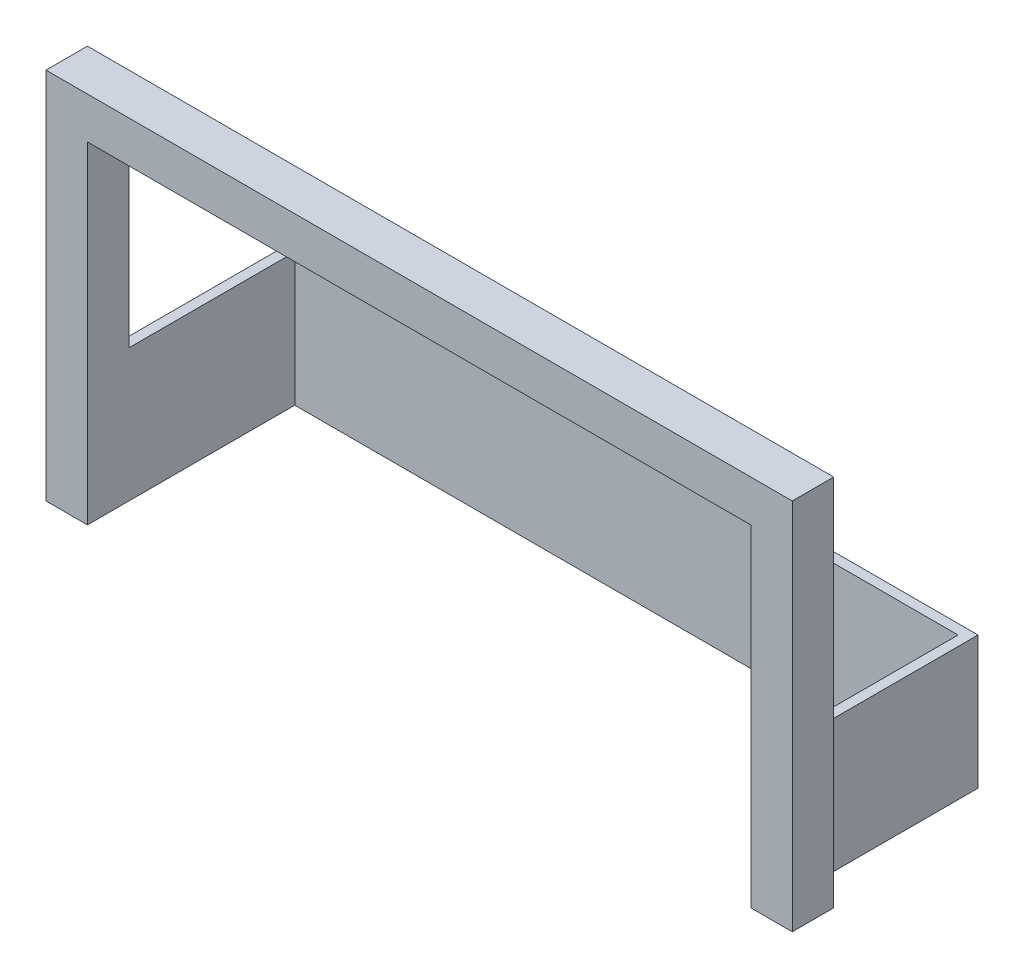
ISO-10303-21;
HEADER;
FILE_DESCRIPTION(('STEP AP214'),'2;1');
FILE_NAME('part.step','',(''),(''),'','','');
FILE_SCHEMA(('AUTOMOTIVE_DESIGN { 1 0 10303 214 1 1 1 1 }'));
ENDSEC;
DATA;
#1=APPLICATION_CONTEXT('core data for automotive mechanical design processes');
#2=APPLICATION_PROTOCOL_DEFINITION('international standard','automotive_design',2000,#1);
#3=PRODUCT_CONTEXT('',#1,'mechanical');
#4=PRODUCT('Part','Part','',(#3));
#5=PRODUCT_RELATED_PRODUCT_CATEGORY('part','',(#4));
#6=PRODUCT_DEFINITION_FORMATION('','',#4);
#7=PRODUCT_DEFINITION_CONTEXT('part definition',#1,'design');
#8=PRODUCT_DEFINITION('design','',#6,#7);
#9=PRODUCT_DEFINITION_SHAPE('','',#8);
#10=(LENGTH_UNIT() NAMED_UNIT(*) SI_UNIT(.MILLI.,.METRE.));
#11=(NAMED_UNIT(*) PLANE_ANGLE_UNIT() SI_UNIT($,.RADIAN.));
#12=(NAMED_UNIT(*) SI_UNIT($,.STERADIAN.) SOLID_ANGLE_UNIT());
#13=UNCERTAINTY_MEASURE_WITH_UNIT(LENGTH_MEASURE(1.E-05),#10,'distance_accuracy_value','');
#14=(GEOMETRIC_REPRESENTATION_CONTEXT(3) GLOBAL_UNCERTAINTY_ASSIGNED_CONTEXT((#13)) GLOBAL_UNIT_ASSIGNED_CONTEXT((#10,
#11,#12)) REPRESENTATION_CONTEXT('',''));
#15=CARTESIAN_POINT('',(0.,0.,0.));
#16=DIRECTION('',(0.,0.,1.));
#17=DIRECTION('',(1.,0.,0.));
#18=AXIS2_PLACEMENT_3D('',#15,#16,#17);
#19=CARTESIAN_POINT('',(1000.,1000.,-125.));
#20=DIRECTION('',(-1.,0.,0.));
#21=DIRECTION('',(0.,0.,1.));
#22=AXIS2_PLACEMENT_3D('',#19,#20,#21);
#23=PLANE('',#22);
#24=DIRECTION('',(0.,-1.,0.));
#25=VECTOR('',#24,1.);
#26=CARTESIAN_POINT('',(1000.,1000.,0.));
#27=LINE('',#26,#25);
#28=CARTESIAN_POINT('',(1000.,1000.,0.));
#29=VERTEX_POINT('',#28);
#30=CARTESIAN_POINT('',(1000.,0.,0.));
#31=VERTEX_POINT('',#30);
#32=EDGE_CURVE('E166',#29,#31,#27,.T.);
#33=ORIENTED_EDGE('',*,*,#32,.F.);
#34=DIRECTION('',(0.,0.,1.));
#35=VECTOR('',#34,1.);
#36=CARTESIAN_POINT('',(1000.,1000.,-125.));
#37=LINE('',#36,#35);
#38=CARTESIAN_POINT('',(1000.,1000.,-125.));
#39=VERTEX_POINT('',#38);
#40=EDGE_CURVE('E44',#39,#29,#37,.T.);
#41=ORIENTED_EDGE('',*,*,#40,.F.);
#42=DIRECTION('',(0.,-1.,0.));
#43=VECTOR('',#42,1.);
#44=CARTESIAN_POINT('',(1000.,1000.,-125.));
#45=LINE('',#44,#43);
#46=CARTESIAN_POINT('',(1000.,400.,-125.));
#47=VERTEX_POINT('',#46);
#48=EDGE_CURVE('E145',#39,#47,#45,.T.);
#49=ORIENTED_EDGE('',*,*,#48,.T.);
#50=DIRECTION('',(0.,0.,1.));
#51=VECTOR('',#50,1.);
#52=CARTESIAN_POINT('',(1000.,400.,-625.));
#53=LINE('',#52,#51);
#54=CARTESIAN_POINT('',(1000.,400.,-625.));
#55=VERTEX_POINT('',#54);
#56=EDGE_CURVE('E224',#55,#47,#53,.T.);
#57=ORIENTED_EDGE('',*,*,#56,.F.);
#58=DIRECTION('',(0.,-1.,0.));
#59=VECTOR('',#58,1.);
#60=CARTESIAN_POINT('',(1000.,400.,-625.));
#61=LINE('',#60,#59);
#62=CARTESIAN_POINT('',(1000.,3.06161699786838E-13,-625.));
#63=VERTEX_POINT('',#62);
#64=EDGE_CURVE('E281',#55,#63,#61,.T.);
#65=ORIENTED_EDGE('',*,*,#64,.T.);
#66=DIRECTION('',(0.,0.,1.));
#67=VECTOR('',#66,1.);
#68=CARTESIAN_POINT('',(1000.,0.,-125.));
#69=LINE('',#68,#67);
#70=EDGE_CURVE('E11',#63,#31,#69,.T.);
#71=ORIENTED_EDGE('',*,*,#70,.T.);
#72=EDGE_LOOP('',(#33,#41,#49,#57,#65,#71));
#73=FACE_BOUND('',#72,.T.);
#74=ADVANCED_FACE('F35',(#73),#23,.T.);
#75=CARTESIAN_POINT('',(-1000.,1000.,-125.));
#76=DIRECTION('',(0.,-1.,0.));
#77=DIRECTION('',(0.,0.,-1.));
#78=AXIS2_PLACEMENT_3D('',#75,#76,#77);
#79=PLANE('',#78);
#80=DIRECTION('',(1.,0.,0.));
#81=VECTOR('',#80,1.);
#82=CARTESIAN_POINT('',(-1000.,1000.,0.));
#83=LINE('',#82,#81);
#84=CARTESIAN_POINT('',(-1000.,1000.,0.));
#85=VERTEX_POINT('',#84);
#86=EDGE_CURVE('E163',#85,#29,#83,.T.);
#87=ORIENTED_EDGE('',*,*,#86,.F.);
#88=DIRECTION('',(0.,0.,1.));
#89=VECTOR('',#88,1.);
#90=CARTESIAN_POINT('',(-1000.,1000.,-125.));
#91=LINE('',#90,#89);
#92=CARTESIAN_POINT('',(-1000.,1000.,-125.));
#93=VERTEX_POINT('',#92);
#94=EDGE_CURVE('E170',#93,#85,#91,.T.);
#95=ORIENTED_EDGE('',*,*,#94,.F.);
#96=DIRECTION('',(1.,0.,0.));
#97=VECTOR('',#96,1.);
#98=CARTESIAN_POINT('',(-1000.,1000.,-125.));
#99=LINE('',#98,#97);
#100=EDGE_CURVE('E143',#93,#39,#99,.T.);
#101=ORIENTED_EDGE('',*,*,#100,.T.);
#102=ORIENTED_EDGE('',*,*,#40,.T.);
#103=EDGE_LOOP('',(#87,#95,#101,#102));
#104=FACE_BOUND('',#103,.T.);
#105=ADVANCED_FACE('F183',(#104),#79,.T.);
#106=CARTESIAN_POINT('',(-1000.,1000.,-125.));
#107=DIRECTION('',(1.,0.,0.));
#108=DIRECTION('',(0.,1.,0.));
#109=AXIS2_PLACEMENT_3D('',#106,#107,#108);
#110=PLANE('',#109);
#111=DIRECTION('',(0.,1.,0.));
#112=VECTOR('',#111,1.);
#113=CARTESIAN_POINT('',(-1000.,1000.,0.));
#114=LINE('',#113,#112);
#115=CARTESIAN_POINT('',(-1000.,0.,0.));
#116=VERTEX_POINT('',#115);
#117=EDGE_CURVE('E160',#116,#85,#114,.T.);
#118=ORIENTED_EDGE('',*,*,#117,.F.);
#119=DIRECTION('',(0.,0.,1.));
#120=VECTOR('',#119,1.);
#121=CARTESIAN_POINT('',(-1000.,0.,-125.));
#122=LINE('',#121,#120);
#123=CARTESIAN_POINT('',(-1000.,-3.06161699786838E-13,-625.));
#124=VERTEX_POINT('',#123);
#125=EDGE_CURVE('E120',#124,#116,#122,.T.);
#126=ORIENTED_EDGE('',*,*,#125,.F.);
#127=DIRECTION('',(0.,-1.,0.));
#128=VECTOR('',#127,1.);
#129=CARTESIAN_POINT('',(-1000.,400.,-625.));
#130=LINE('',#129,#128);
#131=CARTESIAN_POINT('',(-1000.,400.,-625.));
#132=VERTEX_POINT('',#131);
#133=EDGE_CURVE('E279',#132,#124,#130,.T.);
#134=ORIENTED_EDGE('',*,*,#133,.F.);
#135=DIRECTION('',(0.,0.,-1.));
#136=VECTOR('',#135,1.);
#137=CARTESIAN_POINT('',(-1000.,400.,-125.));
#138=LINE('',#137,#136);
#139=CARTESIAN_POINT('',(-1000.,400.,-125.));
#140=VERTEX_POINT('',#139);
#141=EDGE_CURVE('E296',#140,#132,#138,.T.);
#142=ORIENTED_EDGE('',*,*,#141,.F.);
#143=DIRECTION('',(0.,1.,0.));
#144=VECTOR('',#143,1.);
#145=CARTESIAN_POINT('',(-1000.,1000.,-125.));
#146=LINE('',#145,#144);
#147=EDGE_CURVE('E133',#140,#93,#146,.T.);
#148=ORIENTED_EDGE('',*,*,#147,.T.);
#149=ORIENTED_EDGE('',*,*,#94,.T.);
#150=EDGE_LOOP('',(#118,#126,#134,#142,#148,#149));
#151=FACE_BOUND('',#150,.T.);
#152=ADVANCED_FACE('F188',(#151),#110,.T.);
#153=CARTESIAN_POINT('',(-1125.,0.,-125.));
#154=DIRECTION('',(0.,-1.,0.));
#155=DIRECTION('',(1.,0.,0.));
#156=AXIS2_PLACEMENT_3D('',#153,#154,#155);
#157=PLANE('',#156);
#158=DIRECTION('',(1.,0.,0.));
#159=VECTOR('',#158,1.);
#160=CARTESIAN_POINT('',(-1125.,0.,0.));
#161=LINE('',#160,#159);
#162=CARTESIAN_POINT('',(-1125.,0.,0.));
#163=VERTEX_POINT('',#162);
#164=EDGE_CURVE('E115',#163,#116,#161,.T.);
#165=ORIENTED_EDGE('',*,*,#164,.F.);
#166=DIRECTION('',(0.,0.,1.));
#167=VECTOR('',#166,1.);
#168=CARTESIAN_POINT('',(-1125.,0.,-125.));
#169=LINE('',#168,#167);
#170=CARTESIAN_POINT('',(-1125.,0.,-125.));
#171=VERTEX_POINT('',#170);
#172=EDGE_CURVE('E108',#171,#163,#169,.T.);
#173=ORIENTED_EDGE('',*,*,#172,.F.);
#174=DIRECTION('',(1.,0.,0.));
#175=VECTOR('',#174,1.);
#176=CARTESIAN_POINT('',(-1125.,0.,-125.));
#177=LINE('',#176,#175);
#178=CARTESIAN_POINT('',(-1030.,-3.15346550780443E-13,-125.));
#179=VERTEX_POINT('',#178);
#180=EDGE_CURVE('E113',#171,#179,#177,.T.);
#181=ORIENTED_EDGE('',*,*,#180,.T.);
#182=DIRECTION('',(0.,0.,-1.));
#183=VECTOR('',#182,1.);
#184=CARTESIAN_POINT('',(-1030.,-3.15346550780443E-13,-125.));
#185=LINE('',#184,#183);
#186=CARTESIAN_POINT('',(-1030.,-3.15346550780443E-13,-655.));
#187=VERTEX_POINT('',#186);
#188=EDGE_CURVE('E270',#179,#187,#185,.T.);
#189=ORIENTED_EDGE('',*,*,#188,.T.);
#190=DIRECTION('',(1.,0.,0.));
#191=VECTOR('',#190,1.);
#192=CARTESIAN_POINT('',(-1000.,-3.06161699786838E-13,-655.));
#193=LINE('',#192,#191);
#194=CARTESIAN_POINT('',(1030.,3.15346550780443E-13,-655.));
#195=VERTEX_POINT('',#194);
#196=EDGE_CURVE('E259',#187,#195,#193,.T.);
#197=ORIENTED_EDGE('',*,*,#196,.T.);
#198=DIRECTION('',(0.,0.,1.));
#199=VECTOR('',#198,1.);
#200=CARTESIAN_POINT('',(1030.,3.15346550780443E-13,-625.));
#201=LINE('',#200,#199);
#202=CARTESIAN_POINT('',(1030.,0.,-125.));
#203=VERTEX_POINT('',#202);
#204=EDGE_CURVE('E52',#195,#203,#201,.T.);
#205=ORIENTED_EDGE('',*,*,#204,.T.);
#206=DIRECTION('',(1.,0.,0.));
#207=VECTOR('',#206,1.);
#208=CARTESIAN_POINT('',(1000.,0.,-125.));
#209=LINE('',#208,#207);
#210=CARTESIAN_POINT('',(1125.,0.,-125.));
#211=VERTEX_POINT('',#210);
#212=EDGE_CURVE('E95',#203,#211,#209,.T.);
#213=ORIENTED_EDGE('',*,*,#212,.T.);
#214=DIRECTION('',(0.,0.,1.));
#215=VECTOR('',#214,1.);
#216=CARTESIAN_POINT('',(1125.,0.,-125.));
#217=LINE('',#216,#215);
#218=CARTESIAN_POINT('',(1125.,0.,0.));
#219=VERTEX_POINT('',#218);
#220=EDGE_CURVE('E39',#211,#219,#217,.T.);
#221=ORIENTED_EDGE('',*,*,#220,.T.);
#222=DIRECTION('',(1.,0.,0.));
#223=VECTOR('',#222,1.);
#224=CARTESIAN_POINT('',(1000.,0.,0.));
#225=LINE('',#224,#223);
#226=EDGE_CURVE('E147',#31,#219,#225,.T.);
#227=ORIENTED_EDGE('',*,*,#226,.F.);
#228=ORIENTED_EDGE('',*,*,#70,.F.);
#229=DIRECTION('',(1.,0.,0.));
#230=VECTOR('',#229,1.);
#231=CARTESIAN_POINT('',(-1000.,-3.06161699786838E-13,-625.));
#232=LINE('',#231,#230);
#233=EDGE_CURVE('E268',#124,#63,#232,.T.);
#234=ORIENTED_EDGE('',*,*,#233,.F.);
#235=ORIENTED_EDGE('',*,*,#125,.T.);
#236=EDGE_LOOP('',(#165,#173,#181,#189,#197,#205,#213,#221,#227,#228,#234,#235));
#237=FACE_BOUND('',#236,.T.);
#238=ADVANCED_FACE('F110',(#237),#157,.T.);
#239=CARTESIAN_POINT('',(-1125.,1125.,-125.));
#240=DIRECTION('',(-1.,0.,0.));
#241=DIRECTION('',(0.,-1.,0.));
#242=AXIS2_PLACEMENT_3D('',#239,#240,#241);
#243=PLANE('',#242);
#244=DIRECTION('',(0.,-1.,0.));
#245=VECTOR('',#244,1.);
#246=CARTESIAN_POINT('',(-1125.,1125.,0.));
#247=LINE('',#246,#245);
#248=CARTESIAN_POINT('',(-1125.,1125.,0.));
#249=VERTEX_POINT('',#248);
#250=EDGE_CURVE('E157',#249,#163,#247,.T.);
#251=ORIENTED_EDGE('',*,*,#250,.F.);
#252=DIRECTION('',(0.,0.,1.));
#253=VECTOR('',#252,1.);
#254=CARTESIAN_POINT('',(-1125.,1125.,-125.));
#255=LINE('',#254,#253);
#256=CARTESIAN_POINT('',(-1125.,1125.,-125.));
#257=VERTEX_POINT('',#256);
#258=EDGE_CURVE('E121',#257,#249,#255,.T.);
#259=ORIENTED_EDGE('',*,*,#258,.F.);
#260=DIRECTION('',(0.,-1.,0.));
#261=VECTOR('',#260,1.);
#262=CARTESIAN_POINT('',(-1125.,1125.,-125.));
#263=LINE('',#262,#261);
#264=EDGE_CURVE('E128',#257,#171,#263,.T.);
#265=ORIENTED_EDGE('',*,*,#264,.T.);
#266=ORIENTED_EDGE('',*,*,#172,.T.);
#267=EDGE_LOOP('',(#251,#259,#265,#266));
#268=FACE_BOUND('',#267,.T.);
#269=ADVANCED_FACE('F135',(#268),#243,.T.);
#270=CARTESIAN_POINT('',(-1125.,1125.,-125.));
#271=DIRECTION('',(0.,1.,0.));
#272=DIRECTION('',(0.,0.,1.));
#273=AXIS2_PLACEMENT_3D('',#270,#271,#272);
#274=PLANE('',#273);
#275=DIRECTION('',(-1.,0.,0.));
#276=VECTOR('',#275,1.);
#277=CARTESIAN_POINT('',(-1125.,1125.,0.));
#278=LINE('',#277,#276);
#279=CARTESIAN_POINT('',(1125.,1125.,0.));
#280=VERTEX_POINT('',#279);
#281=EDGE_CURVE('E154',#280,#249,#278,.T.);
#282=ORIENTED_EDGE('',*,*,#281,.F.);
#283=DIRECTION('',(0.,0.,1.));
#284=VECTOR('',#283,1.);
#285=CARTESIAN_POINT('',(1125.,1125.,-125.));
#286=LINE('',#285,#284);
#287=CARTESIAN_POINT('',(1125.,1125.,-125.));
#288=VERTEX_POINT('',#287);
#289=EDGE_CURVE('E173',#288,#280,#286,.T.);
#290=ORIENTED_EDGE('',*,*,#289,.F.);
#291=DIRECTION('',(-1.,0.,0.));
#292=VECTOR('',#291,1.);
#293=CARTESIAN_POINT('',(-1125.,1125.,-125.));
#294=LINE('',#293,#292);
#295=EDGE_CURVE('E136',#288,#257,#294,.T.);
#296=ORIENTED_EDGE('',*,*,#295,.T.);
#297=ORIENTED_EDGE('',*,*,#258,.T.);
#298=EDGE_LOOP('',(#282,#290,#296,#297));
#299=FACE_BOUND('',#298,.T.);
#300=ADVANCED_FACE('F200',(#299),#274,.T.);
#301=CARTESIAN_POINT('',(1125.,1125.,-125.));
#302=DIRECTION('',(1.,0.,0.));
#303=DIRECTION('',(0.,1.,0.));
#304=AXIS2_PLACEMENT_3D('',#301,#302,#303);
#305=PLANE('',#304);
#306=DIRECTION('',(0.,1.,0.));
#307=VECTOR('',#306,1.);
#308=CARTESIAN_POINT('',(1125.,1125.,0.));
#309=LINE('',#308,#307);
#310=EDGE_CURVE('E150',#219,#280,#309,.T.);
#311=ORIENTED_EDGE('',*,*,#310,.F.);
#312=ORIENTED_EDGE('',*,*,#220,.F.);
#313=DIRECTION('',(0.,1.,0.));
#314=VECTOR('',#313,1.);
#315=CARTESIAN_POINT('',(1125.,1125.,-125.));
#316=LINE('',#315,#314);
#317=EDGE_CURVE('E138',#211,#288,#316,.T.);
#318=ORIENTED_EDGE('',*,*,#317,.T.);
#319=ORIENTED_EDGE('',*,*,#289,.T.);
#320=EDGE_LOOP('',(#311,#312,#318,#319));
#321=FACE_BOUND('',#320,.T.);
#322=ADVANCED_FACE('F37',(#321),#305,.T.);
#323=CARTESIAN_POINT('',(0.,0.,-125.));
#324=DIRECTION('',(0.,0.,-1.));
#325=DIRECTION('',(-1.,0.,0.));
#326=AXIS2_PLACEMENT_3D('',#323,#324,#325);
#327=PLANE('',#326);
#328=DIRECTION('',(0.,-1.,0.));
#329=VECTOR('',#328,1.);
#330=CARTESIAN_POINT('',(-1030.,400.,-125.));
#331=LINE('',#330,#329);
#332=CARTESIAN_POINT('',(-1030.,400.,-125.));
#333=VERTEX_POINT('',#332);
#334=EDGE_CURVE('E132',#333,#179,#331,.T.);
#335=ORIENTED_EDGE('',*,*,#334,.T.);
#336=ORIENTED_EDGE('',*,*,#180,.F.);
#337=ORIENTED_EDGE('',*,*,#264,.F.);
#338=ORIENTED_EDGE('',*,*,#295,.F.);
#339=ORIENTED_EDGE('',*,*,#317,.F.);
#340=ORIENTED_EDGE('',*,*,#212,.F.);
#341=DIRECTION('',(0.,-1.,0.));
#342=VECTOR('',#341,1.);
#343=CARTESIAN_POINT('',(1030.,400.,-125.));
#344=LINE('',#343,#342);
#345=CARTESIAN_POINT('',(1030.,400.,-125.));
#346=VERTEX_POINT('',#345);
#347=EDGE_CURVE('E267',#346,#203,#344,.T.);
#348=ORIENTED_EDGE('',*,*,#347,.F.);
#349=DIRECTION('',(1.,0.,0.));
#350=VECTOR('',#349,1.);
#351=CARTESIAN_POINT('',(1000.,400.,-125.));
#352=LINE('',#351,#350);
#353=EDGE_CURVE('E220',#47,#346,#352,.T.);
#354=ORIENTED_EDGE('',*,*,#353,.F.);
#355=ORIENTED_EDGE('',*,*,#48,.F.);
#356=ORIENTED_EDGE('',*,*,#100,.F.);
#357=ORIENTED_EDGE('',*,*,#147,.F.);
#358=DIRECTION('',(1.,0.,0.));
#359=VECTOR('',#358,1.);
#360=CARTESIAN_POINT('',(-1030.,400.,-125.));
#361=LINE('',#360,#359);
#362=EDGE_CURVE('E286',#333,#140,#361,.T.);
#363=ORIENTED_EDGE('',*,*,#362,.F.);
#364=EDGE_LOOP('',(#335,#336,#337,#338,#339,#340,#348,#354,#355,#356,#357,#363));
#365=FACE_BOUND('',#364,.T.);
#366=ADVANCED_FACE('F126',(#365),#327,.T.);
#367=CARTESIAN_POINT('',(0.,0.,0.));
#368=DIRECTION('',(0.,0.,-1.));
#369=DIRECTION('',(-1.,0.,0.));
#370=AXIS2_PLACEMENT_3D('',#367,#368,#369);
#371=PLANE('',#370);
#372=ORIENTED_EDGE('',*,*,#226,.T.);
#373=ORIENTED_EDGE('',*,*,#310,.T.);
#374=ORIENTED_EDGE('',*,*,#281,.T.);
#375=ORIENTED_EDGE('',*,*,#250,.T.);
#376=ORIENTED_EDGE('',*,*,#164,.T.);
#377=ORIENTED_EDGE('',*,*,#117,.T.);
#378=ORIENTED_EDGE('',*,*,#86,.T.);
#379=ORIENTED_EDGE('',*,*,#32,.T.);
#380=EDGE_LOOP('',(#372,#373,#374,#375,#376,#377,#378,#379));
#381=FACE_BOUND('',#380,.T.);
#382=ADVANCED_FACE('F180',(#381),#371,.F.);
#383=CARTESIAN_POINT('',(1030.,400.,-625.));
#384=DIRECTION('',(1.,0.,0.));
#385=DIRECTION('',(0.,1.,0.));
#386=AXIS2_PLACEMENT_3D('',#383,#384,#385);
#387=PLANE('',#386);
#388=ORIENTED_EDGE('',*,*,#204,.F.);
#389=DIRECTION('',(0.,-1.,0.));
#390=VECTOR('',#389,1.);
#391=CARTESIAN_POINT('',(1030.,400.,-655.));
#392=LINE('',#391,#390);
#393=CARTESIAN_POINT('',(1030.,400.,-655.));
#394=VERTEX_POINT('',#393);
#395=EDGE_CURVE('E151',#394,#195,#392,.T.);
#396=ORIENTED_EDGE('',*,*,#395,.F.);
#397=DIRECTION('',(0.,0.,1.));
#398=VECTOR('',#397,1.);
#399=CARTESIAN_POINT('',(1030.,400.,-625.));
#400=LINE('',#399,#398);
#401=EDGE_CURVE('E271',#394,#346,#400,.T.);
#402=ORIENTED_EDGE('',*,*,#401,.T.);
#403=ORIENTED_EDGE('',*,*,#347,.T.);
#404=EDGE_LOOP('',(#388,#396,#402,#403));
#405=FACE_BOUND('',#404,.T.);
#406=ADVANCED_FACE('F266',(#405),#387,.T.);
#407=CARTESIAN_POINT('',(-1000.,400.,-655.));
#408=DIRECTION('',(0.,0.,-1.));
#409=DIRECTION('',(-1.,0.,0.));
#410=AXIS2_PLACEMENT_3D('',#407,#408,#409);
#411=PLANE('',#410);
#412=ORIENTED_EDGE('',*,*,#196,.F.);
#413=DIRECTION('',(0.,-1.,0.));
#414=VECTOR('',#413,1.);
#415=CARTESIAN_POINT('',(-1030.,400.,-655.));
#416=LINE('',#415,#414);
#417=CARTESIAN_POINT('',(-1030.,400.,-655.));
#418=VERTEX_POINT('',#417);
#419=EDGE_CURVE('E253',#418,#187,#416,.T.);
#420=ORIENTED_EDGE('',*,*,#419,.F.);
#421=DIRECTION('',(1.,0.,0.));
#422=VECTOR('',#421,1.);
#423=CARTESIAN_POINT('',(-1000.,400.,-655.));
#424=LINE('',#423,#422);
#425=EDGE_CURVE('E261',#418,#394,#424,.T.);
#426=ORIENTED_EDGE('',*,*,#425,.T.);
#427=ORIENTED_EDGE('',*,*,#395,.T.);
#428=EDGE_LOOP('',(#412,#420,#426,#427));
#429=FACE_BOUND('',#428,.T.);
#430=ADVANCED_FACE('F258',(#429),#411,.T.);
#431=CARTESIAN_POINT('',(-1030.,400.,-125.));
#432=DIRECTION('',(-1.,0.,0.));
#433=DIRECTION('',(0.,-1.,0.));
#434=AXIS2_PLACEMENT_3D('',#431,#432,#433);
#435=PLANE('',#434);
#436=ORIENTED_EDGE('',*,*,#188,.F.);
#437=ORIENTED_EDGE('',*,*,#334,.F.);
#438=DIRECTION('',(0.,0.,-1.));
#439=VECTOR('',#438,1.);
#440=CARTESIAN_POINT('',(-1030.,400.,-125.));
#441=LINE('',#440,#439);
#442=EDGE_CURVE('E284',#333,#418,#441,.T.);
#443=ORIENTED_EDGE('',*,*,#442,.T.);
#444=ORIENTED_EDGE('',*,*,#419,.T.);
#445=EDGE_LOOP('',(#436,#437,#443,#444));
#446=FACE_BOUND('',#445,.T.);
#447=ADVANCED_FACE('F303',(#446),#435,.T.);
#448=CARTESIAN_POINT('',(-1000.,400.,-625.));
#449=DIRECTION('',(0.,0.,-1.));
#450=DIRECTION('',(-1.,0.,0.));
#451=AXIS2_PLACEMENT_3D('',#448,#449,#450);
#452=PLANE('',#451);
#453=ORIENTED_EDGE('',*,*,#233,.T.);
#454=ORIENTED_EDGE('',*,*,#64,.F.);
#455=DIRECTION('',(1.,0.,0.));
#456=VECTOR('',#455,1.);
#457=CARTESIAN_POINT('',(-1000.,400.,-625.));
#458=LINE('',#457,#456);
#459=EDGE_CURVE('E295',#132,#55,#458,.T.);
#460=ORIENTED_EDGE('',*,*,#459,.F.);
#461=ORIENTED_EDGE('',*,*,#133,.T.);
#462=EDGE_LOOP('',(#453,#454,#460,#461));
#463=FACE_BOUND('',#462,.T.);
#464=ADVANCED_FACE('F293',(#463),#452,.F.);
#465=CARTESIAN_POINT('',(-1.22464679914735E-13,400.,0.));
#466=DIRECTION('',(0.,1.,0.));
#467=DIRECTION('',(-1.,0.,0.));
#468=AXIS2_PLACEMENT_3D('',#465,#466,#467);
#469=PLANE('',#468);
#470=ORIENTED_EDGE('',*,*,#401,.F.);
#471=ORIENTED_EDGE('',*,*,#425,.F.);
#472=ORIENTED_EDGE('',*,*,#442,.F.);
#473=ORIENTED_EDGE('',*,*,#362,.T.);
#474=ORIENTED_EDGE('',*,*,#141,.T.);
#475=ORIENTED_EDGE('',*,*,#459,.T.);
#476=ORIENTED_EDGE('',*,*,#56,.T.);
#477=ORIENTED_EDGE('',*,*,#353,.T.);
#478=EDGE_LOOP('',(#470,#471,#472,#473,#474,#475,#476,#477));
#479=FACE_BOUND('',#478,.T.);
#480=ADVANCED_FACE('F302',(#479),#469,.T.);
#481=CLOSED_SHELL('',(#74,#105,#152,#238,#269,#300,#322,#366,#382,#406,#430,#447,#464,#480));
#482=MANIFOLD_SOLID_BREP('B2',#481);
#483=ADVANCED_BREP_SHAPE_REPRESENTATION('',(#18,#482),#14);
#484=SHAPE_DEFINITION_REPRESENTATION(#9,#483);
ENDSEC;
END-ISO-10303-21;
